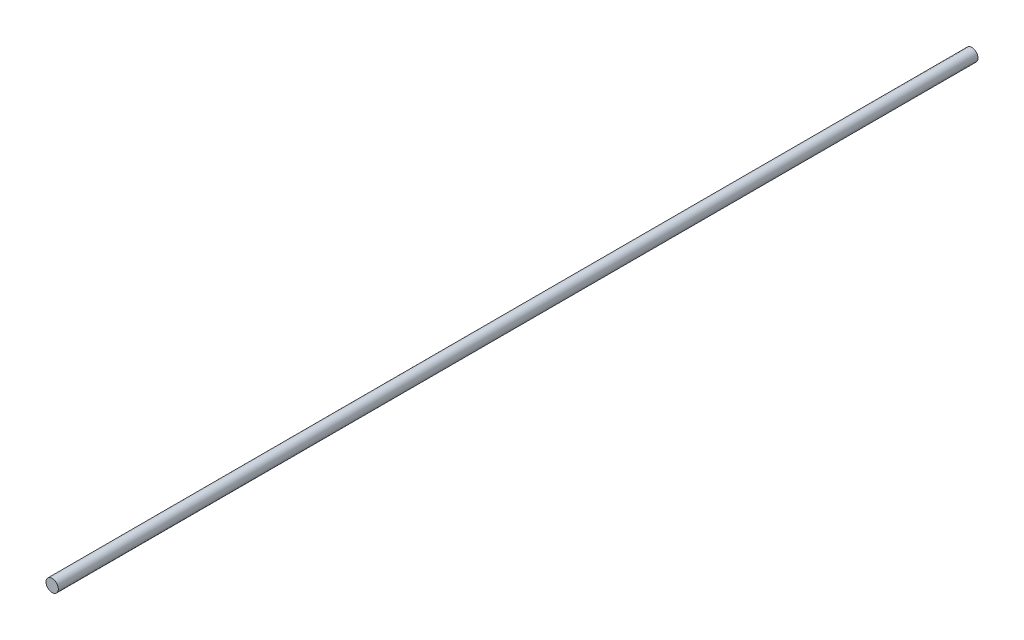
ISO-10303-21;
HEADER;
FILE_DESCRIPTION(('STEP AP214'),'2;1');
FILE_NAME('part.step','',(''),(''),'','','');
FILE_SCHEMA(('AUTOMOTIVE_DESIGN { 1 0 10303 214 1 1 1 1 }'));
ENDSEC;
DATA;
#1=APPLICATION_CONTEXT('core data for automotive mechanical design processes');
#2=APPLICATION_PROTOCOL_DEFINITION('international standard','automotive_design',2000,#1);
#3=PRODUCT_CONTEXT('',#1,'mechanical');
#4=PRODUCT('Part','Part','',(#3));
#5=PRODUCT_RELATED_PRODUCT_CATEGORY('part','',(#4));
#6=PRODUCT_DEFINITION_FORMATION('','',#4);
#7=PRODUCT_DEFINITION_CONTEXT('part definition',#1,'design');
#8=PRODUCT_DEFINITION('design','',#6,#7);
#9=PRODUCT_DEFINITION_SHAPE('','',#8);
#10=(LENGTH_UNIT() NAMED_UNIT(*) SI_UNIT(.MILLI.,.METRE.));
#11=(NAMED_UNIT(*) PLANE_ANGLE_UNIT() SI_UNIT($,.RADIAN.));
#12=(NAMED_UNIT(*) SI_UNIT($,.STERADIAN.) SOLID_ANGLE_UNIT());
#13=UNCERTAINTY_MEASURE_WITH_UNIT(LENGTH_MEASURE(1.E-05),#10,'distance_accuracy_value','');
#14=(GEOMETRIC_REPRESENTATION_CONTEXT(3) GLOBAL_UNCERTAINTY_ASSIGNED_CONTEXT((#13)) GLOBAL_UNIT_ASSIGNED_CONTEXT((#10,
#11,#12)) REPRESENTATION_CONTEXT('',''));
#15=CARTESIAN_POINT('',(0.,0.,0.));
#16=DIRECTION('',(0.,0.,1.));
#17=DIRECTION('',(1.,0.,0.));
#18=AXIS2_PLACEMENT_3D('',#15,#16,#17);
#19=CARTESIAN_POINT('',(0.,0.,177.8));
#20=DIRECTION('',(0.,0.,-1.));
#21=DIRECTION('',(-1.,0.,0.));
#22=AXIS2_PLACEMENT_3D('',#19,#20,#21);
#23=CYLINDRICAL_SURFACE('',#22,2.38125);
#24=CARTESIAN_POINT('',(0.,0.,177.8));
#25=DIRECTION('',(0.,0.,1.));
#26=DIRECTION('',(1.,0.,0.));
#27=AXIS2_PLACEMENT_3D('',#24,#25,#26);
#28=CIRCLE('',#27,2.38125);
#29=CARTESIAN_POINT('',(2.38125,0.,177.8));
#30=VERTEX_POINT('',#29);
#31=EDGE_CURVE('E10',#30,#30,#28,.T.);
#32=ORIENTED_EDGE('',*,*,#31,.F.);
#33=EDGE_LOOP('',(#32));
#34=FACE_BOUND('',#33,.T.);
#35=CARTESIAN_POINT('',(0.,0.,-177.8));
#36=DIRECTION('',(0.,0.,1.));
#37=DIRECTION('',(1.,0.,0.));
#38=AXIS2_PLACEMENT_3D('',#35,#36,#37);
#39=CIRCLE('',#38,2.38125);
#40=CARTESIAN_POINT('',(2.38125,0.,-177.8));
#41=VERTEX_POINT('',#40);
#42=EDGE_CURVE('E34',#41,#41,#39,.T.);
#43=ORIENTED_EDGE('',*,*,#42,.T.);
#44=EDGE_LOOP('',(#43));
#45=FACE_BOUND('',#44,.T.);
#46=ADVANCED_FACE('F31',(#34,#45),#23,.T.);
#47=CARTESIAN_POINT('',(0.,0.,177.8));
#48=DIRECTION('',(0.,0.,1.));
#49=DIRECTION('',(1.,0.,0.));
#50=AXIS2_PLACEMENT_3D('',#47,#48,#49);
#51=PLANE('',#50);
#52=ORIENTED_EDGE('',*,*,#31,.T.);
#53=EDGE_LOOP('',(#52));
#54=FACE_BOUND('',#53,.T.);
#55=ADVANCED_FACE('F46',(#54),#51,.T.);
#56=CARTESIAN_POINT('',(0.,0.,-177.8));
#57=DIRECTION('',(0.,0.,1.));
#58=DIRECTION('',(1.,0.,0.));
#59=AXIS2_PLACEMENT_3D('',#56,#57,#58);
#60=PLANE('',#59);
#61=ORIENTED_EDGE('',*,*,#42,.F.);
#62=EDGE_LOOP('',(#61));
#63=FACE_BOUND('',#62,.T.);
#64=ADVANCED_FACE('F44',(#63),#60,.F.);
#65=CLOSED_SHELL('',(#46,#55,#64));
#66=MANIFOLD_SOLID_BREP('B2',#65);
#67=ADVANCED_BREP_SHAPE_REPRESENTATION('',(#18,#66),#14);
#68=SHAPE_DEFINITION_REPRESENTATION(#9,#67);
ENDSEC;
END-ISO-10303-21;
